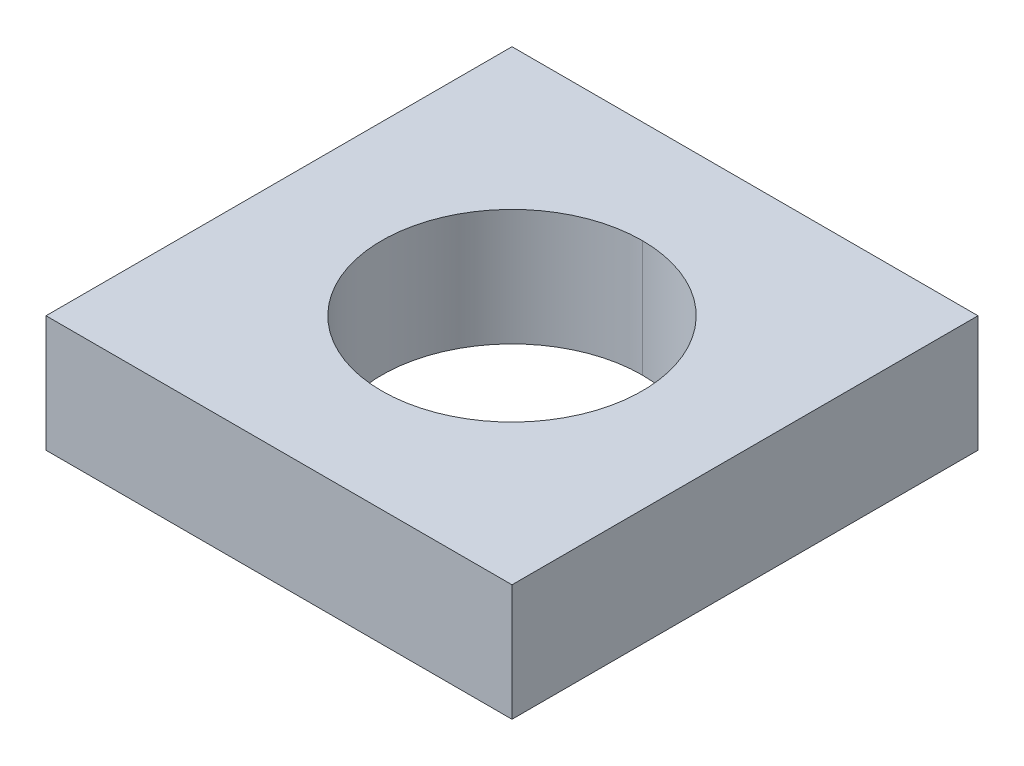
ISO-10303-21;
HEADER;
FILE_DESCRIPTION(('STEP AP214'),'2;1');
FILE_NAME('part.step','',(''),(''),'','','');
FILE_SCHEMA(('AUTOMOTIVE_DESIGN { 1 0 10303 214 1 1 1 1 }'));
ENDSEC;
DATA;
#1=APPLICATION_CONTEXT('core data for automotive mechanical design processes');
#2=APPLICATION_PROTOCOL_DEFINITION('international standard','automotive_design',2000,#1);
#3=PRODUCT_CONTEXT('',#1,'mechanical');
#4=PRODUCT('Part','Part','',(#3));
#5=PRODUCT_RELATED_PRODUCT_CATEGORY('part','',(#4));
#6=PRODUCT_DEFINITION_FORMATION('','',#4);
#7=PRODUCT_DEFINITION_CONTEXT('part definition',#1,'design');
#8=PRODUCT_DEFINITION('design','',#6,#7);
#9=PRODUCT_DEFINITION_SHAPE('','',#8);
#10=(LENGTH_UNIT() NAMED_UNIT(*) SI_UNIT(.MILLI.,.METRE.));
#11=(NAMED_UNIT(*) PLANE_ANGLE_UNIT() SI_UNIT($,.RADIAN.));
#12=(NAMED_UNIT(*) SI_UNIT($,.STERADIAN.) SOLID_ANGLE_UNIT());
#13=UNCERTAINTY_MEASURE_WITH_UNIT(LENGTH_MEASURE(1.E-05),#10,'distance_accuracy_value','');
#14=(GEOMETRIC_REPRESENTATION_CONTEXT(3) GLOBAL_UNCERTAINTY_ASSIGNED_CONTEXT((#13)) GLOBAL_UNIT_ASSIGNED_CONTEXT((#10,
#11,#12)) REPRESENTATION_CONTEXT('',''));
#15=CARTESIAN_POINT('',(0.,0.,0.));
#16=DIRECTION('',(0.,0.,1.));
#17=DIRECTION('',(1.,0.,0.));
#18=AXIS2_PLACEMENT_3D('',#15,#16,#17);
#19=CARTESIAN_POINT('',(6.35,3.175,6.35));
#20=DIRECTION('',(0.,-1.,0.));
#21=DIRECTION('',(0.,0.,-1.));
#22=AXIS2_PLACEMENT_3D('',#19,#20,#21);
#23=CYLINDRICAL_SURFACE('',#22,3.55);
#24=DIRECTION('',(0.,-1.,0.));
#25=VECTOR('',#24,1.);
#26=CARTESIAN_POINT('',(6.35,3.175,9.9));
#27=LINE('',#26,#25);
#28=CARTESIAN_POINT('',(6.35,3.175,9.9));
#29=VERTEX_POINT('',#28);
#30=CARTESIAN_POINT('',(6.35,0.,9.9));
#31=VERTEX_POINT('',#30);
#32=EDGE_CURVE('E140',#29,#31,#27,.T.);
#33=ORIENTED_EDGE('',*,*,#32,.F.);
#34=CARTESIAN_POINT('',(6.35,3.175,6.35));
#35=DIRECTION('',(0.,-1.,0.));
#36=DIRECTION('',(0.,0.,-1.));
#37=AXIS2_PLACEMENT_3D('',#34,#35,#36);
#38=CIRCLE('',#37,3.55);
#39=CARTESIAN_POINT('',(6.35,3.175,2.8));
#40=VERTEX_POINT('',#39);
#41=EDGE_CURVE('E10',#40,#29,#38,.T.);
#42=ORIENTED_EDGE('',*,*,#41,.F.);
#43=DIRECTION('',(0.,-1.,0.));
#44=VECTOR('',#43,1.);
#45=CARTESIAN_POINT('',(6.35,3.175,2.8));
#46=LINE('',#45,#44);
#47=CARTESIAN_POINT('',(6.35,0.,2.8));
#48=VERTEX_POINT('',#47);
#49=EDGE_CURVE('E145',#40,#48,#46,.T.);
#50=ORIENTED_EDGE('',*,*,#49,.T.);
#51=CARTESIAN_POINT('',(6.35,0.,6.35));
#52=DIRECTION('',(0.,-1.,0.));
#53=DIRECTION('',(0.,0.,-1.));
#54=AXIS2_PLACEMENT_3D('',#51,#52,#53);
#55=CIRCLE('',#54,3.55);
#56=EDGE_CURVE('E121',#48,#31,#55,.T.);
#57=ORIENTED_EDGE('',*,*,#56,.T.);
#58=EDGE_LOOP('',(#33,#42,#50,#57));
#59=FACE_BOUND('',#58,.T.);
#60=ADVANCED_FACE('F15',(#59),#23,.F.);
#61=CARTESIAN_POINT('',(0.,0.,0.));
#62=DIRECTION('',(0.,0.,-1.));
#63=DIRECTION('',(0.,-1.,0.));
#64=AXIS2_PLACEMENT_3D('',#61,#62,#63);
#65=PLANE('',#64);
#66=DIRECTION('',(0.,-1.,0.));
#67=VECTOR('',#66,1.);
#68=CARTESIAN_POINT('',(0.,0.,0.));
#69=LINE('',#68,#67);
#70=CARTESIAN_POINT('',(0.,3.175,0.));
#71=VERTEX_POINT('',#70);
#72=CARTESIAN_POINT('',(0.,0.,0.));
#73=VERTEX_POINT('',#72);
#74=EDGE_CURVE('E147',#71,#73,#69,.T.);
#75=ORIENTED_EDGE('',*,*,#74,.F.);
#76=DIRECTION('',(-1.,0.,0.));
#77=VECTOR('',#76,1.);
#78=CARTESIAN_POINT('',(0.,3.175,0.));
#79=LINE('',#78,#77);
#80=CARTESIAN_POINT('',(12.7,3.175,0.));
#81=VERTEX_POINT('',#80);
#82=EDGE_CURVE('E111',#81,#71,#79,.T.);
#83=ORIENTED_EDGE('',*,*,#82,.F.);
#84=DIRECTION('',(0.,1.,0.));
#85=VECTOR('',#84,1.);
#86=CARTESIAN_POINT('',(12.7,0.,0.));
#87=LINE('',#86,#85);
#88=CARTESIAN_POINT('',(12.7,0.,0.));
#89=VERTEX_POINT('',#88);
#90=EDGE_CURVE('E95',#89,#81,#87,.T.);
#91=ORIENTED_EDGE('',*,*,#90,.F.);
#92=DIRECTION('',(1.,0.,0.));
#93=VECTOR('',#92,1.);
#94=CARTESIAN_POINT('',(0.,0.,0.));
#95=LINE('',#94,#93);
#96=EDGE_CURVE('E124',#73,#89,#95,.T.);
#97=ORIENTED_EDGE('',*,*,#96,.F.);
#98=EDGE_LOOP('',(#75,#83,#91,#97));
#99=FACE_BOUND('',#98,.T.);
#100=ADVANCED_FACE('F173',(#99),#65,.T.);
#101=CARTESIAN_POINT('',(0.,0.,12.7));
#102=DIRECTION('',(0.,0.,-1.));
#103=DIRECTION('',(0.,-1.,0.));
#104=AXIS2_PLACEMENT_3D('',#101,#102,#103);
#105=PLANE('',#104);
#106=DIRECTION('',(0.,-1.,0.));
#107=VECTOR('',#106,1.);
#108=CARTESIAN_POINT('',(0.,0.,12.7));
#109=LINE('',#108,#107);
#110=CARTESIAN_POINT('',(0.,3.175,12.7));
#111=VERTEX_POINT('',#110);
#112=CARTESIAN_POINT('',(0.,0.,12.7));
#113=VERTEX_POINT('',#112);
#114=EDGE_CURVE('E116',#111,#113,#109,.T.);
#115=ORIENTED_EDGE('',*,*,#114,.T.);
#116=DIRECTION('',(1.,0.,0.));
#117=VECTOR('',#116,1.);
#118=CARTESIAN_POINT('',(0.,0.,12.7));
#119=LINE('',#118,#117);
#120=CARTESIAN_POINT('',(12.7,0.,12.7));
#121=VERTEX_POINT('',#120);
#122=EDGE_CURVE('E113',#113,#121,#119,.T.);
#123=ORIENTED_EDGE('',*,*,#122,.T.);
#124=DIRECTION('',(0.,1.,0.));
#125=VECTOR('',#124,1.);
#126=CARTESIAN_POINT('',(12.7,0.,12.7));
#127=LINE('',#126,#125);
#128=CARTESIAN_POINT('',(12.7,3.175,12.7));
#129=VERTEX_POINT('',#128);
#130=EDGE_CURVE('E103',#121,#129,#127,.T.);
#131=ORIENTED_EDGE('',*,*,#130,.T.);
#132=DIRECTION('',(-1.,0.,0.));
#133=VECTOR('',#132,1.);
#134=CARTESIAN_POINT('',(0.,3.175,12.7));
#135=LINE('',#134,#133);
#136=EDGE_CURVE('E26',#129,#111,#135,.T.);
#137=ORIENTED_EDGE('',*,*,#136,.T.);
#138=EDGE_LOOP('',(#115,#123,#131,#137));
#139=FACE_BOUND('',#138,.T.);
#140=ADVANCED_FACE('F114',(#139),#105,.F.);
#141=CARTESIAN_POINT('',(0.,3.175,12.7));
#142=DIRECTION('',(0.,-1.,0.));
#143=DIRECTION('',(-1.,0.,0.));
#144=AXIS2_PLACEMENT_3D('',#141,#142,#143);
#145=PLANE('',#144);
#146=ORIENTED_EDGE('',*,*,#41,.T.);
#147=CARTESIAN_POINT('',(6.35,3.175,6.35));
#148=DIRECTION('',(0.,-1.,0.));
#149=DIRECTION('',(0.,0.,-1.));
#150=AXIS2_PLACEMENT_3D('',#147,#148,#149);
#151=CIRCLE('',#150,3.55);
#152=EDGE_CURVE('E19',#29,#40,#151,.T.);
#153=ORIENTED_EDGE('',*,*,#152,.T.);
#154=EDGE_LOOP('',(#146,#153));
#155=FACE_BOUND('',#154,.T.);
#156=ORIENTED_EDGE('',*,*,#82,.T.);
#157=DIRECTION('',(0.,0.,-1.));
#158=VECTOR('',#157,1.);
#159=CARTESIAN_POINT('',(0.,3.175,12.7));
#160=LINE('',#159,#158);
#161=EDGE_CURVE('E131',#111,#71,#160,.T.);
#162=ORIENTED_EDGE('',*,*,#161,.F.);
#163=ORIENTED_EDGE('',*,*,#136,.F.);
#164=DIRECTION('',(0.,0.,-1.));
#165=VECTOR('',#164,1.);
#166=CARTESIAN_POINT('',(12.7,3.175,12.7));
#167=LINE('',#166,#165);
#168=EDGE_CURVE('E109',#129,#81,#167,.T.);
#169=ORIENTED_EDGE('',*,*,#168,.T.);
#170=EDGE_LOOP('',(#156,#162,#163,#169));
#171=FACE_BOUND('',#170,.T.);
#172=ADVANCED_FACE('F17',(#155,#171),#145,.F.);
#173=CARTESIAN_POINT('',(12.7,0.,12.7));
#174=DIRECTION('',(-1.,0.,0.));
#175=DIRECTION('',(0.,0.,1.));
#176=AXIS2_PLACEMENT_3D('',#173,#174,#175);
#177=PLANE('',#176);
#178=ORIENTED_EDGE('',*,*,#90,.T.);
#179=ORIENTED_EDGE('',*,*,#168,.F.);
#180=ORIENTED_EDGE('',*,*,#130,.F.);
#181=DIRECTION('',(0.,0.,-1.));
#182=VECTOR('',#181,1.);
#183=CARTESIAN_POINT('',(12.7,0.,12.7));
#184=LINE('',#183,#182);
#185=EDGE_CURVE('E107',#121,#89,#184,.T.);
#186=ORIENTED_EDGE('',*,*,#185,.T.);
#187=EDGE_LOOP('',(#178,#179,#180,#186));
#188=FACE_BOUND('',#187,.T.);
#189=ADVANCED_FACE('F105',(#188),#177,.F.);
#190=CARTESIAN_POINT('',(0.,0.,12.7));
#191=DIRECTION('',(0.,1.,0.));
#192=DIRECTION('',(1.,0.,0.));
#193=AXIS2_PLACEMENT_3D('',#190,#191,#192);
#194=PLANE('',#193);
#195=ORIENTED_EDGE('',*,*,#56,.F.);
#196=CARTESIAN_POINT('',(6.35,0.,6.35));
#197=DIRECTION('',(0.,-1.,0.));
#198=DIRECTION('',(0.,0.,-1.));
#199=AXIS2_PLACEMENT_3D('',#196,#197,#198);
#200=CIRCLE('',#199,3.55);
#201=EDGE_CURVE('E144',#31,#48,#200,.T.);
#202=ORIENTED_EDGE('',*,*,#201,.F.);
#203=EDGE_LOOP('',(#195,#202));
#204=FACE_BOUND('',#203,.T.);
#205=ORIENTED_EDGE('',*,*,#96,.T.);
#206=ORIENTED_EDGE('',*,*,#185,.F.);
#207=ORIENTED_EDGE('',*,*,#122,.F.);
#208=DIRECTION('',(0.,0.,-1.));
#209=VECTOR('',#208,1.);
#210=CARTESIAN_POINT('',(0.,0.,12.7));
#211=LINE('',#210,#209);
#212=EDGE_CURVE('E159',#113,#73,#211,.T.);
#213=ORIENTED_EDGE('',*,*,#212,.T.);
#214=EDGE_LOOP('',(#205,#206,#207,#213));
#215=FACE_BOUND('',#214,.T.);
#216=ADVANCED_FACE('F123',(#204,#215),#194,.F.);
#217=CARTESIAN_POINT('',(0.,0.,12.7));
#218=DIRECTION('',(1.,0.,0.));
#219=DIRECTION('',(0.,1.,0.));
#220=AXIS2_PLACEMENT_3D('',#217,#218,#219);
#221=PLANE('',#220);
#222=ORIENTED_EDGE('',*,*,#74,.T.);
#223=ORIENTED_EDGE('',*,*,#212,.F.);
#224=ORIENTED_EDGE('',*,*,#114,.F.);
#225=ORIENTED_EDGE('',*,*,#161,.T.);
#226=EDGE_LOOP('',(#222,#223,#224,#225));
#227=FACE_BOUND('',#226,.T.);
#228=ADVANCED_FACE('F183',(#227),#221,.F.);
#229=CARTESIAN_POINT('',(6.35,3.175,6.35));
#230=DIRECTION('',(0.,-1.,0.));
#231=DIRECTION('',(0.,0.,-1.));
#232=AXIS2_PLACEMENT_3D('',#229,#230,#231);
#233=CYLINDRICAL_SURFACE('',#232,3.55);
#234=ORIENTED_EDGE('',*,*,#152,.F.);
#235=ORIENTED_EDGE('',*,*,#32,.T.);
#236=ORIENTED_EDGE('',*,*,#201,.T.);
#237=ORIENTED_EDGE('',*,*,#49,.F.);
#238=EDGE_LOOP('',(#234,#235,#236,#237));
#239=FACE_BOUND('',#238,.T.);
#240=ADVANCED_FACE('F170',(#239),#233,.F.);
#241=CLOSED_SHELL('',(#60,#100,#140,#172,#189,#216,#228,#240));
#242=MANIFOLD_SOLID_BREP('B1',#241);
#243=ADVANCED_BREP_SHAPE_REPRESENTATION('',(#18,#242),#14);
#244=SHAPE_DEFINITION_REPRESENTATION(#9,#243);
ENDSEC;
END-ISO-10303-21;
